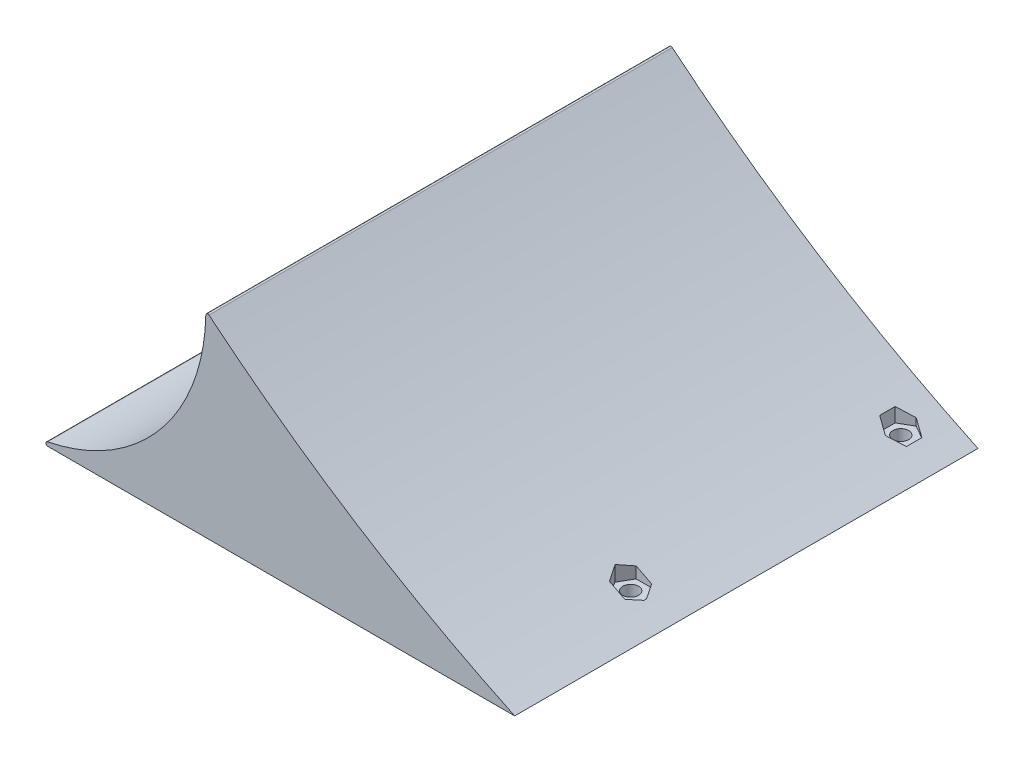
ISO-10303-21;
HEADER;
FILE_DESCRIPTION(('STEP AP214'),'2;1');
FILE_NAME('part.step','',(''),(''),'','','');
FILE_SCHEMA(('AUTOMOTIVE_DESIGN { 1 0 10303 214 1 1 1 1 }'));
ENDSEC;
DATA;
#1=APPLICATION_CONTEXT('core data for automotive mechanical design processes');
#2=APPLICATION_PROTOCOL_DEFINITION('international standard','automotive_design',2000,#1);
#3=PRODUCT_CONTEXT('',#1,'mechanical');
#4=PRODUCT('Part','Part','',(#3));
#5=PRODUCT_RELATED_PRODUCT_CATEGORY('part','',(#4));
#6=PRODUCT_DEFINITION_FORMATION('','',#4);
#7=PRODUCT_DEFINITION_CONTEXT('part definition',#1,'design');
#8=PRODUCT_DEFINITION('design','',#6,#7);
#9=PRODUCT_DEFINITION_SHAPE('','',#8);
#10=(LENGTH_UNIT() NAMED_UNIT(*) SI_UNIT(.MILLI.,.METRE.));
#11=(NAMED_UNIT(*) PLANE_ANGLE_UNIT() SI_UNIT($,.RADIAN.));
#12=(NAMED_UNIT(*) SI_UNIT($,.STERADIAN.) SOLID_ANGLE_UNIT());
#13=UNCERTAINTY_MEASURE_WITH_UNIT(LENGTH_MEASURE(1.E-05),#10,'distance_accuracy_value','');
#14=(GEOMETRIC_REPRESENTATION_CONTEXT(3) GLOBAL_UNCERTAINTY_ASSIGNED_CONTEXT((#13)) GLOBAL_UNIT_ASSIGNED_CONTEXT((#10,
#11,#12)) REPRESENTATION_CONTEXT('',''));
#15=CARTESIAN_POINT('',(0.,0.,0.));
#16=DIRECTION('',(0.,0.,1.));
#17=DIRECTION('',(1.,0.,0.));
#18=AXIS2_PLACEMENT_3D('',#15,#16,#17);
#19=CARTESIAN_POINT('',(0.,-51.,120.));
#20=DIRECTION('',(0.,-1.,0.));
#21=DIRECTION('',(1.,0.,0.));
#22=AXIS2_PLACEMENT_3D('',#19,#20,#21);
#23=PLANE('',#22);
#24=CARTESIAN_POINT('',(29.5995049383621,-51.,-110.));
#25=DIRECTION('',(0.,-1.,0.));
#26=DIRECTION('',(1.,0.,0.));
#27=AXIS2_PLACEMENT_3D('',#24,#25,#26);
#28=CIRCLE('',#27,2.05000000000001);
#29=CARTESIAN_POINT('',(31.6495049383621,-51.,-110.));
#30=VERTEX_POINT('',#29);
#31=EDGE_CURVE('E288',#30,#30,#28,.F.);
#32=ORIENTED_EDGE('',*,*,#31,.T.);
#33=EDGE_LOOP('',(#32));
#34=FACE_BOUND('',#33,.T.);
#35=CARTESIAN_POINT('',(121.,-51.,-110.));
#36=DIRECTION('',(0.,-1.,0.));
#37=DIRECTION('',(1.,0.,0.));
#38=AXIS2_PLACEMENT_3D('',#35,#36,#37);
#39=CIRCLE('',#38,2.05000000000001);
#40=CARTESIAN_POINT('',(123.05,-51.,-110.));
#41=VERTEX_POINT('',#40);
#42=EDGE_CURVE('E285',#41,#41,#39,.T.);
#43=ORIENTED_EDGE('',*,*,#42,.F.);
#44=EDGE_LOOP('',(#43));
#45=FACE_BOUND('',#44,.T.);
#46=CARTESIAN_POINT('',(120.948060341436,-51.,-40.0899621275602));
#47=DIRECTION('',(0.,-1.,0.));
#48=DIRECTION('',(1.,0.,0.));
#49=AXIS2_PLACEMENT_3D('',#46,#47,#48);
#50=CIRCLE('',#49,2.04999999999999);
#51=CARTESIAN_POINT('',(122.998060341436,-51.,-40.0899621275602));
#52=VERTEX_POINT('',#51);
#53=EDGE_CURVE('E289',#52,#52,#50,.T.);
#54=ORIENTED_EDGE('',*,*,#53,.F.);
#55=EDGE_LOOP('',(#54));
#56=FACE_BOUND('',#55,.T.);
#57=DIRECTION('',(0.,0.,-1.));
#58=VECTOR('',#57,1.);
#59=CARTESIAN_POINT('',(131.,-51.,120.));
#60=LINE('',#59,#58);
#61=CARTESIAN_POINT('',(131.,-51.,0.));
#62=VERTEX_POINT('',#61);
#63=CARTESIAN_POINT('',(131.,-51.,-120.));
#64=VERTEX_POINT('',#63);
#65=EDGE_CURVE('E446',#62,#64,#60,.T.);
#66=ORIENTED_EDGE('',*,*,#65,.F.);
#67=DIRECTION('',(-1.,0.,0.));
#68=VECTOR('',#67,1.);
#69=CARTESIAN_POINT('',(0.,-51.,0.));
#70=LINE('',#69,#68);
#71=CARTESIAN_POINT('',(10.0995049383621,-51.,0.));
#72=VERTEX_POINT('',#71);
#73=EDGE_CURVE('E211',#62,#72,#70,.T.);
#74=ORIENTED_EDGE('',*,*,#73,.T.);
#75=DIRECTION('',(0.,0.,-1.));
#76=VECTOR('',#75,1.);
#77=CARTESIAN_POINT('',(10.0995049383621,-51.,120.));
#78=LINE('',#77,#76);
#79=CARTESIAN_POINT('',(10.0995049383621,-51.,-120.));
#80=VERTEX_POINT('',#79);
#81=EDGE_CURVE('E449',#72,#80,#78,.T.);
#82=ORIENTED_EDGE('',*,*,#81,.T.);
#83=DIRECTION('',(-1.,0.,0.));
#84=VECTOR('',#83,1.);
#85=CARTESIAN_POINT('',(0.,-51.,-120.));
#86=LINE('',#85,#84);
#87=EDGE_CURVE('E438',#64,#80,#86,.T.);
#88=ORIENTED_EDGE('',*,*,#87,.F.);
#89=EDGE_LOOP('',(#66,#74,#82,#88));
#90=FACE_BOUND('',#89,.T.);
#91=ADVANCED_FACE('F42',(#34,#45,#56,#90),#23,.T.);
#92=CARTESIAN_POINT('',(0.,0.,120.));
#93=DIRECTION('',(0.,0.,-1.));
#94=DIRECTION('',(-1.,0.,0.));
#95=AXIS2_PLACEMENT_3D('',#92,#93,#94);
#96=CYLINDRICAL_SURFACE('',#95,51.);
#97=CARTESIAN_POINT('',(0.,0.,-131.089282144043));
#98=DIRECTION('',(0.499999999999999,0.,-0.866025403784439));
#99=DIRECTION('',(-0.866025403784439,0.,-0.499999999999999));
#100=AXIS2_PLACEMENT_3D('',#97,#98,#99);
#101=ELLIPSE('',#100,58.8897274573418,51.);
#102=CARTESIAN_POINT('',(33.0636065534998,-38.830373699919,-112.));
#103=VERTEX_POINT('',#102);
#104=CARTESIAN_POINT('',(29.5995049383621,-41.5315459308208,-114.));
#105=VERTEX_POINT('',#104);
#106=EDGE_CURVE('E51',#103,#105,#101,.T.);
#107=ORIENTED_EDGE('',*,*,#106,.F.);
#108=DIRECTION('',(0.,0.,-1.));
#109=VECTOR('',#108,1.);
#110=CARTESIAN_POINT('',(33.0636065534998,-38.830373699919,120.));
#111=LINE('',#110,#109);
#112=CARTESIAN_POINT('',(33.0636065534998,-38.830373699919,-108.));
#113=VERTEX_POINT('',#112);
#114=EDGE_CURVE('E268',#113,#103,#111,.T.);
#115=ORIENTED_EDGE('',*,*,#114,.F.);
#116=CARTESIAN_POINT('',(0.,0.,-88.9107178559569));
#117=DIRECTION('',(0.500000000000002,0.,0.866025403784438));
#118=DIRECTION('',(0.866025403784438,0.,-0.500000000000002));
#119=AXIS2_PLACEMENT_3D('',#116,#117,#118);
#120=ELLIPSE('',#119,58.8897274573419,51.);
#121=CARTESIAN_POINT('',(29.5995049383621,-41.5315459308208,-106.));
#122=VERTEX_POINT('',#121);
#123=EDGE_CURVE('E271',#122,#113,#120,.T.);
#124=ORIENTED_EDGE('',*,*,#123,.F.);
#125=CARTESIAN_POINT('',(0.,0.,-123.089282144043));
#126=DIRECTION('',(-0.500000000000002,0.,0.866025403784438));
#127=DIRECTION('',(-0.866025403784438,0.,-0.500000000000002));
#128=AXIS2_PLACEMENT_3D('',#125,#126,#127);
#129=ELLIPSE('',#128,58.8897274573419,51.);
#130=CARTESIAN_POINT('',(26.1354033232243,-43.794299778994,-108.));
#131=VERTEX_POINT('',#130);
#132=EDGE_CURVE('E274',#131,#122,#129,.T.);
#133=ORIENTED_EDGE('',*,*,#132,.F.);
#134=DIRECTION('',(0.,0.,-1.));
#135=VECTOR('',#134,1.);
#136=CARTESIAN_POINT('',(26.1354033232243,-43.794299778994,120.));
#137=LINE('',#136,#135);
#138=CARTESIAN_POINT('',(26.1354033232243,-43.794299778994,-112.));
#139=VERTEX_POINT('',#138);
#140=EDGE_CURVE('E277',#139,#131,#137,.F.);
#141=ORIENTED_EDGE('',*,*,#140,.F.);
#142=CARTESIAN_POINT('',(0.,0.,-96.910717855957));
#143=DIRECTION('',(-0.499999999999999,0.,-0.866025403784439));
#144=DIRECTION('',(0.866025403784439,0.,-0.499999999999999));
#145=AXIS2_PLACEMENT_3D('',#142,#143,#144);
#146=ELLIPSE('',#145,58.8897274573418,51.);
#147=EDGE_CURVE('E280',#105,#139,#146,.T.);
#148=ORIENTED_EDGE('',*,*,#147,.F.);
#149=EDGE_LOOP('',(#107,#115,#124,#133,#141,#148));
#150=FACE_BOUND('',#149,.T.);
#151=DIRECTION('',(0.,0.,-1.));
#152=VECTOR('',#151,1.);
#153=CARTESIAN_POINT('',(10.0014514923586,-50.0097087378641,120.));
#154=LINE('',#153,#152);
#155=CARTESIAN_POINT('',(10.0014514923586,-50.0097087378641,-120.));
#156=VERTEX_POINT('',#155);
#157=CARTESIAN_POINT('',(10.0014514923586,-50.0097087378641,0.));
#158=VERTEX_POINT('',#157);
#159=EDGE_CURVE('E209',#156,#158,#154,.F.);
#160=ORIENTED_EDGE('',*,*,#159,.T.);
#161=CARTESIAN_POINT('',(0.,0.,0.));
#162=DIRECTION('',(0.,0.,1.));
#163=DIRECTION('',(1.,0.,0.));
#164=AXIS2_PLACEMENT_3D('',#161,#162,#163);
#165=CIRCLE('',#164,51.);
#166=CARTESIAN_POINT('',(50.9892838253327,-1.04543530630317,0.));
#167=VERTEX_POINT('',#166);
#168=EDGE_CURVE('E196',#158,#167,#165,.T.);
#169=ORIENTED_EDGE('',*,*,#168,.T.);
#170=DIRECTION('',(0.,0.,-1.));
#171=VECTOR('',#170,1.);
#172=CARTESIAN_POINT('',(50.9892838253327,-1.04543530630317,120.));
#173=LINE('',#172,#171);
#174=CARTESIAN_POINT('',(50.9892838253327,-1.04543530630317,-120.));
#175=VERTEX_POINT('',#174);
#176=EDGE_CURVE('E206',#167,#175,#173,.T.);
#177=ORIENTED_EDGE('',*,*,#176,.T.);
#178=CARTESIAN_POINT('',(0.,0.,-120.));
#179=DIRECTION('',(0.,0.,1.));
#180=DIRECTION('',(1.,0.,0.));
#181=AXIS2_PLACEMENT_3D('',#178,#179,#180);
#182=CIRCLE('',#181,51.);
#183=EDGE_CURVE('E390',#156,#175,#182,.T.);
#184=ORIENTED_EDGE('',*,*,#183,.F.);
#185=EDGE_LOOP('',(#160,#169,#177,#184));
#186=FACE_BOUND('',#185,.T.);
#187=ADVANCED_FACE('F204',(#150,#186),#96,.F.);
#188=CARTESIAN_POINT('',(291.444081503328,288.922088632672,120.));
#189=DIRECTION('',(0.,0.,-1.));
#190=DIRECTION('',(-1.,0.,0.));
#191=AXIS2_PLACEMENT_3D('',#188,#189,#190);
#192=CYLINDRICAL_SURFACE('',#191,375.884729178833);
#193=DIRECTION('',(0.,0.,-1.));
#194=VECTOR('',#193,1.);
#195=CARTESIAN_POINT('',(124.792241365745,-48.,120.));
#196=LINE('',#195,#194);
#197=CARTESIAN_POINT('',(124.792241365745,-48.,-39.6401514897589));
#198=VERTEX_POINT('',#197);
#199=CARTESIAN_POINT('',(124.792241365745,-48.,-40.3598485102409));
#200=VERTEX_POINT('',#199);
#201=EDGE_CURVE('E246',#198,#200,#196,.T.);
#202=ORIENTED_EDGE('',*,*,#201,.F.);
#203=CARTESIAN_POINT('',(291.444081503328,288.922088632672,-328.289605782906));
#204=DIRECTION('',(0.866025403784444,0.,0.499999999999991));
#205=DIRECTION('',(0.499999999999991,0.,-0.866025403784444));
#206=AXIS2_PLACEMENT_3D('',#203,#204,#205);
#207=ELLIPSE('',#206,751.769458357679,375.884729178833);
#208=CARTESIAN_POINT('',(123.,-47.1075544590422,-36.5358983848623));
#209=VERTEX_POINT('',#208);
#210=EDGE_CURVE('E227',#209,#198,#207,.T.);
#211=ORIENTED_EDGE('',*,*,#210,.F.);
#212=CARTESIAN_POINT('',(291.444081503328,288.922088632672,-36.5358983848623));
#213=DIRECTION('',(0.,0.,1.));
#214=DIRECTION('',(1.,0.,0.));
#215=AXIS2_PLACEMENT_3D('',#212,#213,#214);
#216=CIRCLE('',#215,375.884729178833);
#217=CARTESIAN_POINT('',(119.,-45.0724747726598,-36.5358983848623));
#218=VERTEX_POINT('',#217);
#219=EDGE_CURVE('E230',#218,#209,#216,.T.);
#220=ORIENTED_EDGE('',*,*,#219,.F.);
#221=CARTESIAN_POINT('',(291.444081503328,288.922088632672,262.146012243449));
#222=DIRECTION('',(-0.866025403784437,0.,0.500000000000002));
#223=DIRECTION('',(-0.500000000000002,0.,-0.866025403784438));
#224=AXIS2_PLACEMENT_3D('',#221,#222,#223);
#225=ELLIPSE('',#224,751.769458357663,375.884729178833);
#226=CARTESIAN_POINT('',(117.,-44.0322506667355,-40.));
#227=VERTEX_POINT('',#226);
#228=EDGE_CURVE('E234',#227,#218,#225,.T.);
#229=ORIENTED_EDGE('',*,*,#228,.F.);
#230=CARTESIAN_POINT('',(291.444081503328,288.922088632672,-342.146012243449));
#231=DIRECTION('',(-0.866025403784437,0.,-0.500000000000002));
#232=DIRECTION('',(0.500000000000002,0.,-0.866025403784437));
#233=AXIS2_PLACEMENT_3D('',#230,#231,#232);
#234=ELLIPSE('',#233,751.769458357662,375.884729178833);
#235=CARTESIAN_POINT('',(119.,-45.0724747726598,-43.4641016151378));
#236=VERTEX_POINT('',#235);
#237=EDGE_CURVE('E237',#236,#227,#234,.T.);
#238=ORIENTED_EDGE('',*,*,#237,.F.);
#239=CARTESIAN_POINT('',(291.444081503328,288.922088632672,-43.4641016151378));
#240=DIRECTION('',(0.,0.,-1.));
#241=DIRECTION('',(-1.,0.,0.));
#242=AXIS2_PLACEMENT_3D('',#239,#240,#241);
#243=CIRCLE('',#242,375.884729178833);
#244=CARTESIAN_POINT('',(123.,-47.1075544590422,-43.4641016151378));
#245=VERTEX_POINT('',#244);
#246=EDGE_CURVE('E240',#245,#236,#243,.T.);
#247=ORIENTED_EDGE('',*,*,#246,.F.);
#248=CARTESIAN_POINT('',(291.444081503328,288.922088632672,248.289605782893));
#249=DIRECTION('',(0.866025403784434,0.,-0.500000000000008));
#250=DIRECTION('',(-0.500000000000008,0.,-0.866025403784434));
#251=AXIS2_PLACEMENT_3D('',#248,#249,#250);
#252=ELLIPSE('',#251,751.769458357654,375.884729178833);
#253=EDGE_CURVE('E243',#200,#245,#252,.T.);
#254=ORIENTED_EDGE('',*,*,#253,.F.);
#255=EDGE_LOOP('',(#202,#211,#220,#229,#238,#247,#254));
#256=FACE_BOUND('',#255,.T.);
#257=DIRECTION('',(0.,0.,-1.));
#258=VECTOR('',#257,1.);
#259=CARTESIAN_POINT('',(117.535898384862,-44.3124736118209,120.));
#260=LINE('',#259,#258);
#261=CARTESIAN_POINT('',(117.535898384862,-44.312473611821,-112.));
#262=VERTEX_POINT('',#261);
#263=CARTESIAN_POINT('',(117.535898384862,-44.3124736118209,-108.));
#264=VERTEX_POINT('',#263);
#265=EDGE_CURVE('E265',#262,#264,#260,.F.);
#266=ORIENTED_EDGE('',*,*,#265,.F.);
#267=CARTESIAN_POINT('',(291.444081503328,288.922088632672,-212.405936337725));
#268=DIRECTION('',(-0.5,0.,-0.866025403784438));
#269=DIRECTION('',(0.866025403784438,0.,-0.5));
#270=AXIS2_PLACEMENT_3D('',#267,#268,#269);
#271=ELLIPSE('',#270,434.034299151338,375.884729178833);
#272=CARTESIAN_POINT('',(121.,-46.0975297635221,-114.));
#273=VERTEX_POINT('',#272);
#274=EDGE_CURVE('E249',#273,#262,#271,.T.);
#275=ORIENTED_EDGE('',*,*,#274,.F.);
#276=CARTESIAN_POINT('',(291.444081503328,288.922088632672,-15.5940636622761));
#277=DIRECTION('',(0.499999999999996,0.,-0.866025403784441));
#278=DIRECTION('',(-0.866025403784441,0.,-0.499999999999996));
#279=AXIS2_PLACEMENT_3D('',#276,#277,#278);
#280=ELLIPSE('',#279,434.034299151336,375.884729178833);
#281=CARTESIAN_POINT('',(124.464101615138,-47.8374931855507,-112.));
#282=VERTEX_POINT('',#281);
#283=EDGE_CURVE('E252',#282,#273,#280,.T.);
#284=ORIENTED_EDGE('',*,*,#283,.F.);
#285=DIRECTION('',(0.,0.,-1.));
#286=VECTOR('',#285,1.);
#287=CARTESIAN_POINT('',(124.464101615138,-47.8374931855507,120.));
#288=LINE('',#287,#286);
#289=CARTESIAN_POINT('',(124.464101615138,-47.8374931855507,-108.));
#290=VERTEX_POINT('',#289);
#291=EDGE_CURVE('E256',#290,#282,#288,.T.);
#292=ORIENTED_EDGE('',*,*,#291,.F.);
#293=CARTESIAN_POINT('',(291.444081503328,288.922088632672,-204.405936337724));
#294=DIRECTION('',(0.499999999999997,0.,0.86602540378444));
#295=DIRECTION('',(0.86602540378444,0.,-0.499999999999998));
#296=AXIS2_PLACEMENT_3D('',#293,#294,#295);
#297=ELLIPSE('',#296,434.034299151337,375.884729178833);
#298=CARTESIAN_POINT('',(121.,-46.0975297635222,-106.));
#299=VERTEX_POINT('',#298);
#300=EDGE_CURVE('E259',#299,#290,#297,.T.);
#301=ORIENTED_EDGE('',*,*,#300,.F.);
#302=CARTESIAN_POINT('',(291.444081503328,288.922088632672,-7.59406366227533));
#303=DIRECTION('',(-0.499999999999999,0.,0.866025403784439));
#304=DIRECTION('',(-0.866025403784439,0.,-0.499999999999999));
#305=AXIS2_PLACEMENT_3D('',#302,#303,#304);
#306=ELLIPSE('',#305,434.034299151337,375.884729178833);
#307=EDGE_CURVE('E262',#264,#299,#306,.T.);
#308=ORIENTED_EDGE('',*,*,#307,.F.);
#309=EDGE_LOOP('',(#266,#275,#284,#292,#301,#308));
#310=FACE_BOUND('',#309,.T.);
#311=DIRECTION('',(0.,0.,-1.));
#312=VECTOR('',#311,1.);
#313=CARTESIAN_POINT('',(51.8079415680354,-0.670470088641684,120.));
#314=LINE('',#313,#312);
#315=CARTESIAN_POINT('',(51.8079415680354,-0.670470088641628,-120.));
#316=VERTEX_POINT('',#315);
#317=CARTESIAN_POINT('',(51.8079415680354,-0.670470088641684,0.));
#318=VERTEX_POINT('',#317);
#319=EDGE_CURVE('E220',#316,#318,#314,.F.);
#320=ORIENTED_EDGE('',*,*,#319,.T.);
#321=CARTESIAN_POINT('',(291.444081503328,288.922088632672,0.));
#322=DIRECTION('',(0.,0.,1.));
#323=DIRECTION('',(1.,0.,0.));
#324=AXIS2_PLACEMENT_3D('',#321,#322,#323);
#325=CIRCLE('',#324,375.884729178833);
#326=EDGE_CURVE('E58',#318,#62,#325,.T.);
#327=ORIENTED_EDGE('',*,*,#326,.T.);
#328=ORIENTED_EDGE('',*,*,#65,.T.);
#329=CARTESIAN_POINT('',(291.444081503328,288.922088632672,-120.));
#330=DIRECTION('',(0.,0.,1.));
#331=DIRECTION('',(1.,0.,0.));
#332=AXIS2_PLACEMENT_3D('',#329,#330,#331);
#333=CIRCLE('',#332,375.884729178833);
#334=EDGE_CURVE('E442',#316,#64,#333,.T.);
#335=ORIENTED_EDGE('',*,*,#334,.F.);
#336=EDGE_LOOP('',(#320,#327,#328,#335));
#337=FACE_BOUND('',#336,.T.);
#338=ADVANCED_FACE('F457',(#256,#310,#337),#192,.F.);
#339=CARTESIAN_POINT('',(10.0995049383621,-50.5,120.));
#340=DIRECTION('',(0.,0.,-1.));
#341=DIRECTION('',(-1.,0.,0.));
#342=AXIS2_PLACEMENT_3D('',#339,#340,#341);
#343=CYLINDRICAL_SURFACE('',#342,0.5);
#344=ORIENTED_EDGE('',*,*,#81,.F.);
#345=CARTESIAN_POINT('',(10.0995049383621,-50.5,0.));
#346=DIRECTION('',(0.,0.,1.));
#347=DIRECTION('',(1.,0.,0.));
#348=AXIS2_PLACEMENT_3D('',#345,#346,#347);
#349=CIRCLE('',#348,0.5);
#350=EDGE_CURVE('E465',#72,#158,#349,.F.);
#351=ORIENTED_EDGE('',*,*,#350,.T.);
#352=ORIENTED_EDGE('',*,*,#159,.F.);
#353=CARTESIAN_POINT('',(10.0995049383621,-50.5,-120.));
#354=DIRECTION('',(0.,0.,1.));
#355=DIRECTION('',(1.,0.,0.));
#356=AXIS2_PLACEMENT_3D('',#353,#354,#355);
#357=CIRCLE('',#356,0.5);
#358=EDGE_CURVE('E216',#80,#156,#357,.F.);
#359=ORIENTED_EDGE('',*,*,#358,.F.);
#360=EDGE_LOOP('',(#344,#351,#352,#359));
#361=FACE_BOUND('',#360,.T.);
#362=ADVANCED_FACE('F464',(#361),#343,.T.);
#363=CARTESIAN_POINT('',(51.4891787647967,-1.05568467205124,120.));
#364=DIRECTION('',(0.,0.,-1.));
#365=DIRECTION('',(-1.,0.,0.));
#366=AXIS2_PLACEMENT_3D('',#363,#364,#365);
#367=CYLINDRICAL_SURFACE('',#366,0.5);
#368=ORIENTED_EDGE('',*,*,#176,.F.);
#369=CARTESIAN_POINT('',(51.4891787647967,-1.05568467205124,0.));
#370=DIRECTION('',(0.,0.,1.));
#371=DIRECTION('',(1.,0.,0.));
#372=AXIS2_PLACEMENT_3D('',#369,#370,#371);
#373=CIRCLE('',#372,0.5);
#374=EDGE_CURVE('E12',#167,#318,#373,.F.);
#375=ORIENTED_EDGE('',*,*,#374,.T.);
#376=ORIENTED_EDGE('',*,*,#319,.F.);
#377=CARTESIAN_POINT('',(51.4891787647967,-1.05568467205124,-120.));
#378=DIRECTION('',(0.,0.,1.));
#379=DIRECTION('',(1.,0.,0.));
#380=AXIS2_PLACEMENT_3D('',#377,#378,#379);
#381=CIRCLE('',#380,0.5);
#382=EDGE_CURVE('E213',#175,#316,#381,.F.);
#383=ORIENTED_EDGE('',*,*,#382,.F.);
#384=EDGE_LOOP('',(#368,#375,#376,#383));
#385=FACE_BOUND('',#384,.T.);
#386=ADVANCED_FACE('F44',(#385),#367,.T.);
#387=CARTESIAN_POINT('',(0.,0.,-120.));
#388=DIRECTION('',(0.,0.,1.));
#389=DIRECTION('',(1.,0.,0.));
#390=AXIS2_PLACEMENT_3D('',#387,#388,#389);
#391=PLANE('',#390);
#392=ORIENTED_EDGE('',*,*,#87,.T.);
#393=ORIENTED_EDGE('',*,*,#358,.T.);
#394=ORIENTED_EDGE('',*,*,#183,.T.);
#395=ORIENTED_EDGE('',*,*,#382,.T.);
#396=ORIENTED_EDGE('',*,*,#334,.T.);
#397=EDGE_LOOP('',(#392,#393,#394,#395,#396));
#398=FACE_BOUND('',#397,.T.);
#399=ADVANCED_FACE('F454',(#398),#391,.F.);
#400=CARTESIAN_POINT('',(0.,-48.,120.));
#401=DIRECTION('',(0.,-1.,0.));
#402=DIRECTION('',(1.,0.,0.));
#403=AXIS2_PLACEMENT_3D('',#400,#401,#402);
#404=PLANE('',#403);
#405=CARTESIAN_POINT('',(120.948060341436,-48.,-40.0899621275602));
#406=DIRECTION('',(0.,1.,0.));
#407=DIRECTION('',(-1.,0.,0.));
#408=AXIS2_PLACEMENT_3D('',#405,#406,#407);
#409=CIRCLE('',#408,2.04999999999999);
#410=CARTESIAN_POINT('',(118.898060341436,-48.,-40.0899621275602));
#411=VERTEX_POINT('',#410);
#412=EDGE_CURVE('E476',#411,#411,#409,.T.);
#413=ORIENTED_EDGE('',*,*,#412,.F.);
#414=EDGE_LOOP('',(#413));
#415=FACE_BOUND('',#414,.T.);
#416=ORIENTED_EDGE('',*,*,#201,.T.);
#417=DIRECTION('',(-0.500000000000008,0.,-0.866025403784434));
#418=VECTOR('',#417,1.);
#419=CARTESIAN_POINT('',(125.,-48.,-40.0000000000001));
#420=LINE('',#419,#418);
#421=CARTESIAN_POINT('',(123.,-48.,-43.4641016151378));
#422=VERTEX_POINT('',#421);
#423=EDGE_CURVE('E292',#200,#422,#420,.T.);
#424=ORIENTED_EDGE('',*,*,#423,.T.);
#425=DIRECTION('',(-1.,0.,0.));
#426=VECTOR('',#425,1.);
#427=CARTESIAN_POINT('',(123.,-48.,-43.4641016151378));
#428=LINE('',#427,#426);
#429=CARTESIAN_POINT('',(119.,-48.,-43.4641016151378));
#430=VERTEX_POINT('',#429);
#431=EDGE_CURVE('E304',#422,#430,#428,.T.);
#432=ORIENTED_EDGE('',*,*,#431,.T.);
#433=DIRECTION('',(-0.500000000000002,0.,0.866025403784437));
#434=VECTOR('',#433,1.);
#435=CARTESIAN_POINT('',(119.,-48.,-43.4641016151378));
#436=LINE('',#435,#434);
#437=CARTESIAN_POINT('',(117.,-48.,-40.));
#438=VERTEX_POINT('',#437);
#439=EDGE_CURVE('E325',#430,#438,#436,.T.);
#440=ORIENTED_EDGE('',*,*,#439,.T.);
#441=DIRECTION('',(0.500000000000002,0.,0.866025403784438));
#442=VECTOR('',#441,1.);
#443=CARTESIAN_POINT('',(117.,-48.,-40.));
#444=LINE('',#443,#442);
#445=CARTESIAN_POINT('',(119.,-48.,-36.5358983848623));
#446=VERTEX_POINT('',#445);
#447=EDGE_CURVE('E320',#438,#446,#444,.T.);
#448=ORIENTED_EDGE('',*,*,#447,.T.);
#449=DIRECTION('',(1.,0.,0.));
#450=VECTOR('',#449,1.);
#451=CARTESIAN_POINT('',(119.,-48.,-36.5358983848623));
#452=LINE('',#451,#450);
#453=CARTESIAN_POINT('',(123.,-48.,-36.5358983848623));
#454=VERTEX_POINT('',#453);
#455=EDGE_CURVE('E315',#446,#454,#452,.T.);
#456=ORIENTED_EDGE('',*,*,#455,.T.);
#457=DIRECTION('',(0.499999999999991,0.,-0.866025403784444));
#458=VECTOR('',#457,1.);
#459=CARTESIAN_POINT('',(123.,-48.,-36.5358983848623));
#460=LINE('',#459,#458);
#461=EDGE_CURVE('E309',#454,#198,#460,.T.);
#462=ORIENTED_EDGE('',*,*,#461,.T.);
#463=EDGE_LOOP('',(#416,#424,#432,#440,#448,#456,#462));
#464=FACE_BOUND('',#463,.T.);
#465=ADVANCED_FACE('F566',(#415,#464),#404,.F.);
#466=CARTESIAN_POINT('',(125.,-61.5830052442584,-40.0000000000001));
#467=DIRECTION('',(0.866025403784434,0.,-0.500000000000008));
#468=DIRECTION('',(-0.500000000000008,0.,-0.866025403784434));
#469=AXIS2_PLACEMENT_3D('',#466,#467,#468);
#470=PLANE('',#469);
#471=ORIENTED_EDGE('',*,*,#253,.T.);
#472=DIRECTION('',(0.,1.,0.));
#473=VECTOR('',#472,1.);
#474=CARTESIAN_POINT('',(123.,-61.5830052442584,-43.4641016151378));
#475=LINE('',#474,#473);
#476=EDGE_CURVE('E296',#422,#245,#475,.T.);
#477=ORIENTED_EDGE('',*,*,#476,.F.);
#478=ORIENTED_EDGE('',*,*,#423,.F.);
#479=EDGE_LOOP('',(#471,#477,#478));
#480=FACE_BOUND('',#479,.T.);
#481=ADVANCED_FACE('F570',(#480),#470,.F.);
#482=CARTESIAN_POINT('',(123.,-61.5830052442584,-43.4641016151378));
#483=DIRECTION('',(0.,0.,-1.));
#484=DIRECTION('',(-1.,0.,0.));
#485=AXIS2_PLACEMENT_3D('',#482,#483,#484);
#486=PLANE('',#485);
#487=ORIENTED_EDGE('',*,*,#246,.T.);
#488=DIRECTION('',(0.,1.,0.));
#489=VECTOR('',#488,1.);
#490=CARTESIAN_POINT('',(119.,-61.5830052442584,-43.4641016151378));
#491=LINE('',#490,#489);
#492=EDGE_CURVE('E329',#430,#236,#491,.T.);
#493=ORIENTED_EDGE('',*,*,#492,.F.);
#494=ORIENTED_EDGE('',*,*,#431,.F.);
#495=ORIENTED_EDGE('',*,*,#476,.T.);
#496=EDGE_LOOP('',(#487,#493,#494,#495));
#497=FACE_BOUND('',#496,.T.);
#498=ADVANCED_FACE('F576',(#497),#486,.F.);
#499=CARTESIAN_POINT('',(119.,-61.5830052442584,-43.4641016151378));
#500=DIRECTION('',(-0.866025403784437,0.,-0.500000000000002));
#501=DIRECTION('',(-0.500000000000002,0.,0.866025403784437));
#502=AXIS2_PLACEMENT_3D('',#499,#500,#501);
#503=PLANE('',#502);
#504=ORIENTED_EDGE('',*,*,#237,.T.);
#505=DIRECTION('',(0.,1.,0.));
#506=VECTOR('',#505,1.);
#507=CARTESIAN_POINT('',(117.,-61.5830052442584,-40.));
#508=LINE('',#507,#506);
#509=EDGE_CURVE('E324',#438,#227,#508,.T.);
#510=ORIENTED_EDGE('',*,*,#509,.F.);
#511=ORIENTED_EDGE('',*,*,#439,.F.);
#512=ORIENTED_EDGE('',*,*,#492,.T.);
#513=EDGE_LOOP('',(#504,#510,#511,#512));
#514=FACE_BOUND('',#513,.T.);
#515=ADVANCED_FACE('F758',(#514),#503,.F.);
#516=CARTESIAN_POINT('',(117.,-61.5830052442584,-40.));
#517=DIRECTION('',(-0.866025403784437,0.,0.500000000000002));
#518=DIRECTION('',(0.500000000000002,0.,0.866025403784438));
#519=AXIS2_PLACEMENT_3D('',#516,#517,#518);
#520=PLANE('',#519);
#521=ORIENTED_EDGE('',*,*,#228,.T.);
#522=DIRECTION('',(0.,1.,0.));
#523=VECTOR('',#522,1.);
#524=CARTESIAN_POINT('',(119.,-61.5830052442584,-36.5358983848623));
#525=LINE('',#524,#523);
#526=EDGE_CURVE('E319',#446,#218,#525,.T.);
#527=ORIENTED_EDGE('',*,*,#526,.F.);
#528=ORIENTED_EDGE('',*,*,#447,.F.);
#529=ORIENTED_EDGE('',*,*,#509,.T.);
#530=EDGE_LOOP('',(#521,#527,#528,#529));
#531=FACE_BOUND('',#530,.T.);
#532=ADVANCED_FACE('F749',(#531),#520,.F.);
#533=CARTESIAN_POINT('',(119.,-61.5830052442584,-36.5358983848623));
#534=DIRECTION('',(0.,0.,1.));
#535=DIRECTION('',(1.,0.,0.));
#536=AXIS2_PLACEMENT_3D('',#533,#534,#535);
#537=PLANE('',#536);
#538=ORIENTED_EDGE('',*,*,#219,.T.);
#539=DIRECTION('',(0.,1.,0.));
#540=VECTOR('',#539,1.);
#541=CARTESIAN_POINT('',(123.,-61.5830052442584,-36.5358983848623));
#542=LINE('',#541,#540);
#543=EDGE_CURVE('E314',#454,#209,#542,.T.);
#544=ORIENTED_EDGE('',*,*,#543,.F.);
#545=ORIENTED_EDGE('',*,*,#455,.F.);
#546=ORIENTED_EDGE('',*,*,#526,.T.);
#547=EDGE_LOOP('',(#538,#544,#545,#546));
#548=FACE_BOUND('',#547,.T.);
#549=ADVANCED_FACE('F741',(#548),#537,.F.);
#550=CARTESIAN_POINT('',(123.,-61.5830052442584,-36.5358983848623));
#551=DIRECTION('',(0.866025403784444,0.,0.499999999999991));
#552=DIRECTION('',(0.499999999999991,0.,-0.866025403784444));
#553=AXIS2_PLACEMENT_3D('',#550,#551,#552);
#554=PLANE('',#553);
#555=ORIENTED_EDGE('',*,*,#210,.T.);
#556=ORIENTED_EDGE('',*,*,#461,.F.);
#557=ORIENTED_EDGE('',*,*,#543,.T.);
#558=EDGE_LOOP('',(#555,#556,#557));
#559=FACE_BOUND('',#558,.T.);
#560=ADVANCED_FACE('F563',(#559),#554,.F.);
#561=CARTESIAN_POINT('',(0.,-48.,120.));
#562=DIRECTION('',(0.,-1.,0.));
#563=DIRECTION('',(1.,0.,0.));
#564=AXIS2_PLACEMENT_3D('',#561,#562,#563);
#565=PLANE('',#564);
#566=CARTESIAN_POINT('',(121.,-48.,-110.));
#567=DIRECTION('',(0.,1.,0.));
#568=DIRECTION('',(-1.,0.,0.));
#569=AXIS2_PLACEMENT_3D('',#566,#567,#568);
#570=CIRCLE('',#569,2.05000000000001);
#571=CARTESIAN_POINT('',(118.95,-48.,-110.));
#572=VERTEX_POINT('',#571);
#573=EDGE_CURVE('E467',#572,#572,#570,.T.);
#574=ORIENTED_EDGE('',*,*,#573,.F.);
#575=EDGE_LOOP('',(#574));
#576=FACE_BOUND('',#575,.T.);
#577=DIRECTION('',(-0.866025403784438,0.,0.5));
#578=VECTOR('',#577,1.);
#579=CARTESIAN_POINT('',(117.535898384862,-48.,-112.));
#580=LINE('',#579,#578);
#581=CARTESIAN_POINT('',(121.,-48.,-114.));
#582=VERTEX_POINT('',#581);
#583=CARTESIAN_POINT('',(117.535898384862,-48.,-112.));
#584=VERTEX_POINT('',#583);
#585=EDGE_CURVE('E395',#582,#584,#580,.T.);
#586=ORIENTED_EDGE('',*,*,#585,.T.);
#587=DIRECTION('',(0.,0.,1.));
#588=VECTOR('',#587,1.);
#589=CARTESIAN_POINT('',(117.535898384862,-48.,-108.));
#590=LINE('',#589,#588);
#591=CARTESIAN_POINT('',(117.535898384862,-48.,-108.));
#592=VERTEX_POINT('',#591);
#593=EDGE_CURVE('E313',#584,#592,#590,.T.);
#594=ORIENTED_EDGE('',*,*,#593,.T.);
#595=DIRECTION('',(0.866025403784439,0.,0.499999999999999));
#596=VECTOR('',#595,1.);
#597=CARTESIAN_POINT('',(121.,-48.,-106.));
#598=LINE('',#597,#596);
#599=CARTESIAN_POINT('',(121.,-48.,-106.));
#600=VERTEX_POINT('',#599);
#601=EDGE_CURVE('E415',#592,#600,#598,.T.);
#602=ORIENTED_EDGE('',*,*,#601,.T.);
#603=DIRECTION('',(0.86602540378444,0.,-0.499999999999998));
#604=VECTOR('',#603,1.);
#605=CARTESIAN_POINT('',(124.464101615138,-48.,-108.));
#606=LINE('',#605,#604);
#607=CARTESIAN_POINT('',(124.464101615138,-48.,-108.));
#608=VERTEX_POINT('',#607);
#609=EDGE_CURVE('E410',#600,#608,#606,.T.);
#610=ORIENTED_EDGE('',*,*,#609,.T.);
#611=DIRECTION('',(0.,0.,-1.));
#612=VECTOR('',#611,1.);
#613=CARTESIAN_POINT('',(124.464101615138,-48.,-112.));
#614=LINE('',#613,#612);
#615=CARTESIAN_POINT('',(124.464101615138,-48.,-112.));
#616=VERTEX_POINT('',#615);
#617=EDGE_CURVE('E405',#608,#616,#614,.T.);
#618=ORIENTED_EDGE('',*,*,#617,.T.);
#619=DIRECTION('',(-0.866025403784441,0.,-0.499999999999996));
#620=VECTOR('',#619,1.);
#621=CARTESIAN_POINT('',(121.,-48.,-114.));
#622=LINE('',#621,#620);
#623=EDGE_CURVE('E400',#616,#582,#622,.T.);
#624=ORIENTED_EDGE('',*,*,#623,.T.);
#625=EDGE_LOOP('',(#586,#594,#602,#610,#618,#624));
#626=FACE_BOUND('',#625,.T.);
#627=ADVANCED_FACE('F537',(#576,#626),#565,.F.);
#628=CARTESIAN_POINT('',(117.535898384862,-61.5830052442584,-108.));
#629=DIRECTION('',(-1.,0.,0.));
#630=DIRECTION('',(0.,0.,1.));
#631=AXIS2_PLACEMENT_3D('',#628,#629,#630);
#632=PLANE('',#631);
#633=ORIENTED_EDGE('',*,*,#265,.T.);
#634=DIRECTION('',(0.,1.,0.));
#635=VECTOR('',#634,1.);
#636=CARTESIAN_POINT('',(117.535898384862,-61.5830052442584,-108.));
#637=LINE('',#636,#635);
#638=EDGE_CURVE('E394',#592,#264,#637,.T.);
#639=ORIENTED_EDGE('',*,*,#638,.F.);
#640=ORIENTED_EDGE('',*,*,#593,.F.);
#641=DIRECTION('',(0.,1.,0.));
#642=VECTOR('',#641,1.);
#643=CARTESIAN_POINT('',(117.535898384862,-61.5830052442584,-112.));
#644=LINE('',#643,#642);
#645=EDGE_CURVE('E348',#584,#262,#644,.T.);
#646=ORIENTED_EDGE('',*,*,#645,.T.);
#647=EDGE_LOOP('',(#633,#639,#640,#646));
#648=FACE_BOUND('',#647,.T.);
#649=ADVANCED_FACE('F531',(#648),#632,.F.);
#650=CARTESIAN_POINT('',(121.,-61.5830052442584,-106.));
#651=DIRECTION('',(-0.499999999999999,0.,0.866025403784439));
#652=DIRECTION('',(0.866025403784439,0.,0.499999999999999));
#653=AXIS2_PLACEMENT_3D('',#650,#651,#652);
#654=PLANE('',#653);
#655=ORIENTED_EDGE('',*,*,#307,.T.);
#656=DIRECTION('',(0.,1.,0.));
#657=VECTOR('',#656,1.);
#658=CARTESIAN_POINT('',(121.,-61.5830052442584,-106.));
#659=LINE('',#658,#657);
#660=EDGE_CURVE('E414',#600,#299,#659,.T.);
#661=ORIENTED_EDGE('',*,*,#660,.F.);
#662=ORIENTED_EDGE('',*,*,#601,.F.);
#663=ORIENTED_EDGE('',*,*,#638,.T.);
#664=EDGE_LOOP('',(#655,#661,#662,#663));
#665=FACE_BOUND('',#664,.T.);
#666=ADVANCED_FACE('F534',(#665),#654,.F.);
#667=CARTESIAN_POINT('',(124.464101615138,-61.5830052442584,-108.));
#668=DIRECTION('',(0.499999999999997,0.,0.86602540378444));
#669=DIRECTION('',(0.86602540378444,0.,-0.499999999999998));
#670=AXIS2_PLACEMENT_3D('',#667,#668,#669);
#671=PLANE('',#670);
#672=ORIENTED_EDGE('',*,*,#300,.T.);
#673=DIRECTION('',(0.,1.,0.));
#674=VECTOR('',#673,1.);
#675=CARTESIAN_POINT('',(124.464101615138,-61.5830052442584,-108.));
#676=LINE('',#675,#674);
#677=EDGE_CURVE('E409',#608,#290,#676,.T.);
#678=ORIENTED_EDGE('',*,*,#677,.F.);
#679=ORIENTED_EDGE('',*,*,#609,.F.);
#680=ORIENTED_EDGE('',*,*,#660,.T.);
#681=EDGE_LOOP('',(#672,#678,#679,#680));
#682=FACE_BOUND('',#681,.T.);
#683=ADVANCED_FACE('F549',(#682),#671,.F.);
#684=CARTESIAN_POINT('',(124.464101615138,-61.5830052442584,-112.));
#685=DIRECTION('',(1.,0.,0.));
#686=DIRECTION('',(0.,0.,-1.));
#687=AXIS2_PLACEMENT_3D('',#684,#685,#686);
#688=PLANE('',#687);
#689=ORIENTED_EDGE('',*,*,#291,.T.);
#690=DIRECTION('',(0.,1.,0.));
#691=VECTOR('',#690,1.);
#692=CARTESIAN_POINT('',(124.464101615138,-61.5830052442584,-112.));
#693=LINE('',#692,#691);
#694=EDGE_CURVE('E404',#616,#282,#693,.T.);
#695=ORIENTED_EDGE('',*,*,#694,.F.);
#696=ORIENTED_EDGE('',*,*,#617,.F.);
#697=ORIENTED_EDGE('',*,*,#677,.T.);
#698=EDGE_LOOP('',(#689,#695,#696,#697));
#699=FACE_BOUND('',#698,.T.);
#700=ADVANCED_FACE('F546',(#699),#688,.F.);
#701=CARTESIAN_POINT('',(121.,-61.5830052442584,-114.));
#702=DIRECTION('',(0.499999999999996,0.,-0.866025403784441));
#703=DIRECTION('',(-0.866025403784441,0.,-0.499999999999996));
#704=AXIS2_PLACEMENT_3D('',#701,#702,#703);
#705=PLANE('',#704);
#706=ORIENTED_EDGE('',*,*,#283,.T.);
#707=DIRECTION('',(0.,1.,0.));
#708=VECTOR('',#707,1.);
#709=CARTESIAN_POINT('',(121.,-61.5830052442584,-114.));
#710=LINE('',#709,#708);
#711=EDGE_CURVE('E399',#582,#273,#710,.T.);
#712=ORIENTED_EDGE('',*,*,#711,.F.);
#713=ORIENTED_EDGE('',*,*,#623,.F.);
#714=ORIENTED_EDGE('',*,*,#694,.T.);
#715=EDGE_LOOP('',(#706,#712,#713,#714));
#716=FACE_BOUND('',#715,.T.);
#717=ADVANCED_FACE('F542',(#716),#705,.F.);
#718=CARTESIAN_POINT('',(117.535898384862,-61.5830052442584,-112.));
#719=DIRECTION('',(-0.5,0.,-0.866025403784438));
#720=DIRECTION('',(-0.866025403784438,0.,0.5));
#721=AXIS2_PLACEMENT_3D('',#718,#719,#720);
#722=PLANE('',#721);
#723=ORIENTED_EDGE('',*,*,#274,.T.);
#724=ORIENTED_EDGE('',*,*,#645,.F.);
#725=ORIENTED_EDGE('',*,*,#585,.F.);
#726=ORIENTED_EDGE('',*,*,#711,.T.);
#727=EDGE_LOOP('',(#723,#724,#725,#726));
#728=FACE_BOUND('',#727,.T.);
#729=ADVANCED_FACE('F540',(#728),#722,.F.);
#730=CARTESIAN_POINT('',(0.,-48.,120.));
#731=DIRECTION('',(0.,-1.,0.));
#732=DIRECTION('',(1.,0.,0.));
#733=AXIS2_PLACEMENT_3D('',#730,#731,#732);
#734=PLANE('',#733);
#735=CARTESIAN_POINT('',(29.5995049383621,-48.,-110.));
#736=DIRECTION('',(0.,-1.,0.));
#737=DIRECTION('',(1.,0.,0.));
#738=AXIS2_PLACEMENT_3D('',#735,#736,#737);
#739=CIRCLE('',#738,2.05000000000001);
#740=CARTESIAN_POINT('',(31.6495049383621,-48.,-110.));
#741=VERTEX_POINT('',#740);
#742=EDGE_CURVE('E472',#741,#741,#739,.T.);
#743=ORIENTED_EDGE('',*,*,#742,.T.);
#744=EDGE_LOOP('',(#743));
#745=FACE_BOUND('',#744,.T.);
#746=DIRECTION('',(0.,0.,-1.));
#747=VECTOR('',#746,1.);
#748=CARTESIAN_POINT('',(33.0636065534998,-48.,-112.));
#749=LINE('',#748,#747);
#750=CARTESIAN_POINT('',(33.0636065534998,-48.,-108.));
#751=VERTEX_POINT('',#750);
#752=CARTESIAN_POINT('',(33.0636065534998,-48.,-112.));
#753=VERTEX_POINT('',#752);
#754=EDGE_CURVE('E349',#751,#753,#749,.T.);
#755=ORIENTED_EDGE('',*,*,#754,.T.);
#756=DIRECTION('',(-0.866025403784439,0.,-0.499999999999999));
#757=VECTOR('',#756,1.);
#758=CARTESIAN_POINT('',(29.5995049383621,-48.,-114.));
#759=LINE('',#758,#757);
#760=CARTESIAN_POINT('',(29.5995049383621,-48.,-114.));
#761=VERTEX_POINT('',#760);
#762=EDGE_CURVE('E343',#753,#761,#759,.T.);
#763=ORIENTED_EDGE('',*,*,#762,.T.);
#764=DIRECTION('',(-0.866025403784439,0.,0.499999999999999));
#765=VECTOR('',#764,1.);
#766=CARTESIAN_POINT('',(26.1354033232243,-48.,-112.));
#767=LINE('',#766,#765);
#768=CARTESIAN_POINT('',(26.1354033232243,-48.,-112.));
#769=VERTEX_POINT('',#768);
#770=EDGE_CURVE('E369',#761,#769,#767,.T.);
#771=ORIENTED_EDGE('',*,*,#770,.T.);
#772=DIRECTION('',(0.,0.,1.));
#773=VECTOR('',#772,1.);
#774=CARTESIAN_POINT('',(26.1354033232243,-48.,-108.));
#775=LINE('',#774,#773);
#776=CARTESIAN_POINT('',(26.1354033232243,-48.,-108.));
#777=VERTEX_POINT('',#776);
#778=EDGE_CURVE('E364',#769,#777,#775,.T.);
#779=ORIENTED_EDGE('',*,*,#778,.T.);
#780=DIRECTION('',(0.866025403784438,0.,0.500000000000002));
#781=VECTOR('',#780,1.);
#782=CARTESIAN_POINT('',(29.5995049383621,-48.,-106.));
#783=LINE('',#782,#781);
#784=CARTESIAN_POINT('',(29.5995049383621,-48.,-106.));
#785=VERTEX_POINT('',#784);
#786=EDGE_CURVE('E359',#777,#785,#783,.T.);
#787=ORIENTED_EDGE('',*,*,#786,.T.);
#788=DIRECTION('',(0.866025403784438,0.,-0.500000000000002));
#789=VECTOR('',#788,1.);
#790=CARTESIAN_POINT('',(33.0636065534998,-48.,-108.));
#791=LINE('',#790,#789);
#792=EDGE_CURVE('E354',#785,#751,#791,.T.);
#793=ORIENTED_EDGE('',*,*,#792,.T.);
#794=EDGE_LOOP('',(#755,#763,#771,#779,#787,#793));
#795=FACE_BOUND('',#794,.T.);
#796=ADVANCED_FACE('F483',(#745,#795),#734,.F.);
#797=CARTESIAN_POINT('',(29.5995049383621,-61.5830052442584,-114.));
#798=DIRECTION('',(0.499999999999999,0.,-0.866025403784439));
#799=DIRECTION('',(-0.866025403784439,0.,-0.499999999999999));
#800=AXIS2_PLACEMENT_3D('',#797,#798,#799);
#801=PLANE('',#800);
#802=ORIENTED_EDGE('',*,*,#106,.T.);
#803=DIRECTION('',(0.,1.,0.));
#804=VECTOR('',#803,1.);
#805=CARTESIAN_POINT('',(29.5995049383621,-61.5830052442584,-114.));
#806=LINE('',#805,#804);
#807=EDGE_CURVE('E347',#761,#105,#806,.T.);
#808=ORIENTED_EDGE('',*,*,#807,.F.);
#809=ORIENTED_EDGE('',*,*,#762,.F.);
#810=DIRECTION('',(0.,1.,0.));
#811=VECTOR('',#810,1.);
#812=CARTESIAN_POINT('',(33.0636065534998,-61.5830052442584,-112.));
#813=LINE('',#812,#811);
#814=EDGE_CURVE('E353',#753,#103,#813,.T.);
#815=ORIENTED_EDGE('',*,*,#814,.T.);
#816=EDGE_LOOP('',(#802,#808,#809,#815));
#817=FACE_BOUND('',#816,.T.);
#818=ADVANCED_FACE('F600',(#817),#801,.F.);
#819=CARTESIAN_POINT('',(26.1354033232243,-61.5830052442584,-112.));
#820=DIRECTION('',(-0.499999999999999,0.,-0.866025403784439));
#821=DIRECTION('',(-0.866025403784439,0.,0.499999999999999));
#822=AXIS2_PLACEMENT_3D('',#819,#820,#821);
#823=PLANE('',#822);
#824=ORIENTED_EDGE('',*,*,#147,.T.);
#825=DIRECTION('',(0.,1.,0.));
#826=VECTOR('',#825,1.);
#827=CARTESIAN_POINT('',(26.1354033232243,-61.5830052442584,-112.));
#828=LINE('',#827,#826);
#829=EDGE_CURVE('E368',#769,#139,#828,.T.);
#830=ORIENTED_EDGE('',*,*,#829,.F.);
#831=ORIENTED_EDGE('',*,*,#770,.F.);
#832=ORIENTED_EDGE('',*,*,#807,.T.);
#833=EDGE_LOOP('',(#824,#830,#831,#832));
#834=FACE_BOUND('',#833,.T.);
#835=ADVANCED_FACE('F596',(#834),#823,.F.);
#836=CARTESIAN_POINT('',(26.1354033232243,-61.5830052442584,-108.));
#837=DIRECTION('',(-1.,0.,0.));
#838=DIRECTION('',(0.,0.,1.));
#839=AXIS2_PLACEMENT_3D('',#836,#837,#838);
#840=PLANE('',#839);
#841=ORIENTED_EDGE('',*,*,#140,.T.);
#842=DIRECTION('',(0.,1.,0.));
#843=VECTOR('',#842,1.);
#844=CARTESIAN_POINT('',(26.1354033232243,-61.5830052442584,-108.));
#845=LINE('',#844,#843);
#846=EDGE_CURVE('E363',#777,#131,#845,.T.);
#847=ORIENTED_EDGE('',*,*,#846,.F.);
#848=ORIENTED_EDGE('',*,*,#778,.F.);
#849=ORIENTED_EDGE('',*,*,#829,.T.);
#850=EDGE_LOOP('',(#841,#847,#848,#849));
#851=FACE_BOUND('',#850,.T.);
#852=ADVANCED_FACE('F592',(#851),#840,.F.);
#853=CARTESIAN_POINT('',(29.5995049383621,-61.5830052442584,-106.));
#854=DIRECTION('',(-0.500000000000002,0.,0.866025403784438));
#855=DIRECTION('',(0.866025403784438,0.,0.500000000000002));
#856=AXIS2_PLACEMENT_3D('',#853,#854,#855);
#857=PLANE('',#856);
#858=ORIENTED_EDGE('',*,*,#132,.T.);
#859=DIRECTION('',(0.,1.,0.));
#860=VECTOR('',#859,1.);
#861=CARTESIAN_POINT('',(29.5995049383621,-61.5830052442584,-106.));
#862=LINE('',#861,#860);
#863=EDGE_CURVE('E358',#785,#122,#862,.T.);
#864=ORIENTED_EDGE('',*,*,#863,.F.);
#865=ORIENTED_EDGE('',*,*,#786,.F.);
#866=ORIENTED_EDGE('',*,*,#846,.T.);
#867=EDGE_LOOP('',(#858,#864,#865,#866));
#868=FACE_BOUND('',#867,.T.);
#869=ADVANCED_FACE('F588',(#868),#857,.F.);
#870=CARTESIAN_POINT('',(33.0636065534998,-61.5830052442584,-108.));
#871=DIRECTION('',(0.500000000000002,0.,0.866025403784438));
#872=DIRECTION('',(0.866025403784438,0.,-0.500000000000002));
#873=AXIS2_PLACEMENT_3D('',#870,#871,#872);
#874=PLANE('',#873);
#875=ORIENTED_EDGE('',*,*,#123,.T.);
#876=DIRECTION('',(0.,1.,0.));
#877=VECTOR('',#876,1.);
#878=CARTESIAN_POINT('',(33.0636065534998,-61.5830052442584,-108.));
#879=LINE('',#878,#877);
#880=EDGE_CURVE('E65',#751,#113,#879,.T.);
#881=ORIENTED_EDGE('',*,*,#880,.F.);
#882=ORIENTED_EDGE('',*,*,#792,.F.);
#883=ORIENTED_EDGE('',*,*,#863,.T.);
#884=EDGE_LOOP('',(#875,#881,#882,#883));
#885=FACE_BOUND('',#884,.T.);
#886=ADVANCED_FACE('F585',(#885),#874,.F.);
#887=CARTESIAN_POINT('',(33.0636065534998,-61.5830052442584,-112.));
#888=DIRECTION('',(1.,0.,0.));
#889=DIRECTION('',(0.,0.,-1.));
#890=AXIS2_PLACEMENT_3D('',#887,#888,#889);
#891=PLANE('',#890);
#892=ORIENTED_EDGE('',*,*,#114,.T.);
#893=ORIENTED_EDGE('',*,*,#814,.F.);
#894=ORIENTED_EDGE('',*,*,#754,.F.);
#895=ORIENTED_EDGE('',*,*,#880,.T.);
#896=EDGE_LOOP('',(#892,#893,#894,#895));
#897=FACE_BOUND('',#896,.T.);
#898=ADVANCED_FACE('F582',(#897),#891,.F.);
#899=CARTESIAN_POINT('',(120.948060341436,-53.,-40.0899621275602));
#900=DIRECTION('',(0.,1.,0.));
#901=DIRECTION('',(-1.,0.,0.));
#902=AXIS2_PLACEMENT_3D('',#899,#900,#901);
#903=CYLINDRICAL_SURFACE('',#902,2.04999999999999);
#904=ORIENTED_EDGE('',*,*,#53,.T.);
#905=EDGE_LOOP('',(#904));
#906=FACE_BOUND('',#905,.T.);
#907=ORIENTED_EDGE('',*,*,#412,.T.);
#908=EDGE_LOOP('',(#907));
#909=FACE_BOUND('',#908,.T.);
#910=ADVANCED_FACE('F497',(#906,#909),#903,.F.);
#911=CARTESIAN_POINT('',(121.,-53.,-110.));
#912=DIRECTION('',(0.,1.,0.));
#913=DIRECTION('',(-1.,0.,0.));
#914=AXIS2_PLACEMENT_3D('',#911,#912,#913);
#915=CYLINDRICAL_SURFACE('',#914,2.05000000000001);
#916=ORIENTED_EDGE('',*,*,#42,.T.);
#917=EDGE_LOOP('',(#916));
#918=FACE_BOUND('',#917,.T.);
#919=ORIENTED_EDGE('',*,*,#573,.T.);
#920=EDGE_LOOP('',(#919));
#921=FACE_BOUND('',#920,.T.);
#922=ADVANCED_FACE('F488',(#918,#921),#915,.F.);
#923=CARTESIAN_POINT('',(29.5995049383621,-53.,-110.));
#924=DIRECTION('',(0.,1.,0.));
#925=DIRECTION('',(-1.,0.,0.));
#926=AXIS2_PLACEMENT_3D('',#923,#924,#925);
#927=CYLINDRICAL_SURFACE('',#926,2.05000000000001);
#928=ORIENTED_EDGE('',*,*,#31,.F.);
#929=EDGE_LOOP('',(#928));
#930=FACE_BOUND('',#929,.T.);
#931=ORIENTED_EDGE('',*,*,#742,.F.);
#932=EDGE_LOOP('',(#931));
#933=FACE_BOUND('',#932,.T.);
#934=ADVANCED_FACE('F486',(#930,#933),#927,.F.);
#935=CARTESIAN_POINT('',(70.549752469181,-51.,0.));
#936=DIRECTION('',(0.,0.,1.));
#937=DIRECTION('',(1.,0.,0.));
#938=AXIS2_PLACEMENT_3D('',#935,#936,#937);
#939=PLANE('',#938);
#940=ORIENTED_EDGE('',*,*,#73,.F.);
#941=ORIENTED_EDGE('',*,*,#326,.F.);
#942=ORIENTED_EDGE('',*,*,#374,.F.);
#943=ORIENTED_EDGE('',*,*,#168,.F.);
#944=ORIENTED_EDGE('',*,*,#350,.F.);
#945=EDGE_LOOP('',(#940,#941,#942,#943,#944));
#946=FACE_BOUND('',#945,.T.);
#947=ADVANCED_FACE('F195',(#946),#939,.T.);
#948=CLOSED_SHELL('',(#91,#187,#338,#362,#386,#399,#465,#481,#498,#515,#532,#549,#560,#627,#649,
#666,#683,#700,#717,#729,#796,#818,#835,#852,#869,#886,#898,#910,#922,#934,#947));
#949=MANIFOLD_SOLID_BREP('B2',#948);
#950=ADVANCED_BREP_SHAPE_REPRESENTATION('',(#18,#949),#14);
#951=SHAPE_DEFINITION_REPRESENTATION(#9,#950);
ENDSEC;
END-ISO-10303-21;
